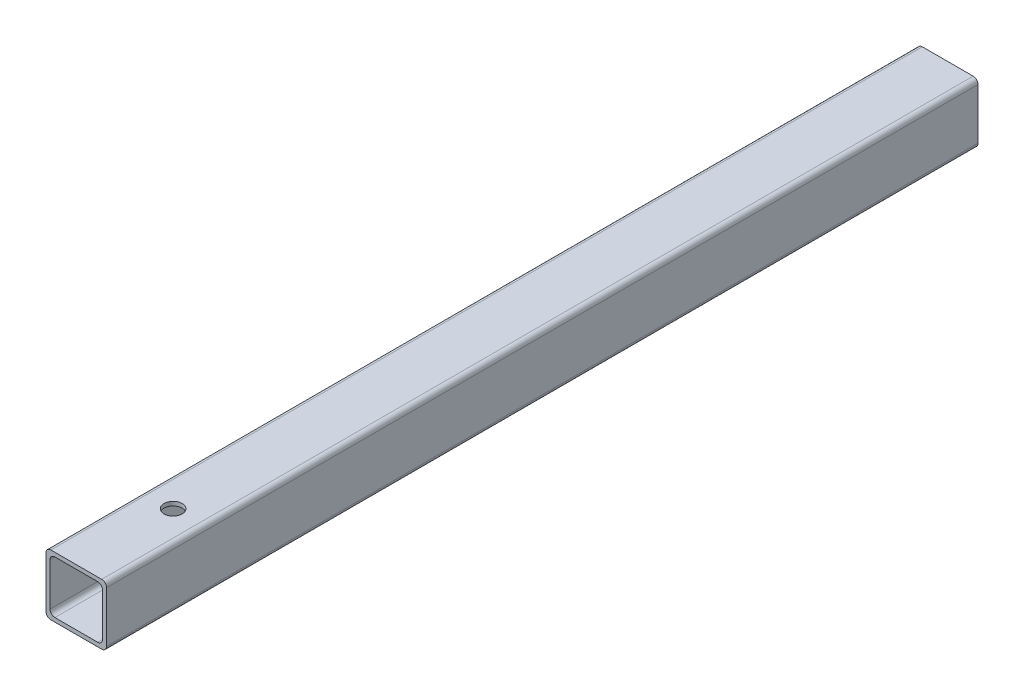
ISO-10303-21;
HEADER;
FILE_DESCRIPTION(('STEP AP214'),'2;1');
FILE_NAME('part.step','',(''),(''),'','','');
FILE_SCHEMA(('AUTOMOTIVE_DESIGN { 1 0 10303 214 1 1 1 1 }'));
ENDSEC;
DATA;
#1=APPLICATION_CONTEXT('core data for automotive mechanical design processes');
#2=APPLICATION_PROTOCOL_DEFINITION('international standard','automotive_design',2000,#1);
#3=PRODUCT_CONTEXT('',#1,'mechanical');
#4=PRODUCT('Part','Part','',(#3));
#5=PRODUCT_RELATED_PRODUCT_CATEGORY('part','',(#4));
#6=PRODUCT_DEFINITION_FORMATION('','',#4);
#7=PRODUCT_DEFINITION_CONTEXT('part definition',#1,'design');
#8=PRODUCT_DEFINITION('design','',#6,#7);
#9=PRODUCT_DEFINITION_SHAPE('','',#8);
#10=(LENGTH_UNIT() NAMED_UNIT(*) SI_UNIT(.MILLI.,.METRE.));
#11=(NAMED_UNIT(*) PLANE_ANGLE_UNIT() SI_UNIT($,.RADIAN.));
#12=(NAMED_UNIT(*) SI_UNIT($,.STERADIAN.) SOLID_ANGLE_UNIT());
#13=UNCERTAINTY_MEASURE_WITH_UNIT(LENGTH_MEASURE(1.E-05),#10,'distance_accuracy_value','');
#14=(GEOMETRIC_REPRESENTATION_CONTEXT(3) GLOBAL_UNCERTAINTY_ASSIGNED_CONTEXT((#13)) GLOBAL_UNIT_ASSIGNED_CONTEXT((#10,
#11,#12)) REPRESENTATION_CONTEXT('',''));
#15=CARTESIAN_POINT('',(0.,0.,0.));
#16=DIRECTION('',(0.,0.,1.));
#17=DIRECTION('',(1.,0.,0.));
#18=AXIS2_PLACEMENT_3D('',#15,#16,#17);
#19=CARTESIAN_POINT('',(0.,0.,457.2));
#20=DIRECTION('',(0.,0.,-1.));
#21=DIRECTION('',(-1.,0.,0.));
#22=AXIS2_PLACEMENT_3D('',#19,#20,#21);
#23=PLANE('',#22);
#24=DIRECTION('',(1.,0.,0.));
#25=VECTOR('',#24,1.);
#26=CARTESIAN_POINT('',(-15.875,-15.875,457.2));
#27=LINE('',#26,#25);
#28=CARTESIAN_POINT('',(-13.335,-15.875,457.2));
#29=VERTEX_POINT('',#28);
#30=CARTESIAN_POINT('',(13.335,-15.875,457.2));
#31=VERTEX_POINT('',#30);
#32=EDGE_CURVE('E191',#29,#31,#27,.T.);
#33=ORIENTED_EDGE('',*,*,#32,.T.);
#34=CARTESIAN_POINT('',(13.335,-13.335,457.2));
#35=DIRECTION('',(0.,0.,-1.));
#36=DIRECTION('',(-1.,0.,0.));
#37=AXIS2_PLACEMENT_3D('',#34,#35,#36);
#38=CIRCLE('',#37,2.54);
#39=CARTESIAN_POINT('',(15.875,-13.335,457.2));
#40=VERTEX_POINT('',#39);
#41=EDGE_CURVE('E212',#31,#40,#38,.F.);
#42=ORIENTED_EDGE('',*,*,#41,.T.);
#43=DIRECTION('',(0.,1.,0.));
#44=VECTOR('',#43,1.);
#45=CARTESIAN_POINT('',(15.875,-15.875,457.2));
#46=LINE('',#45,#44);
#47=CARTESIAN_POINT('',(15.875,13.335,457.2));
#48=VERTEX_POINT('',#47);
#49=EDGE_CURVE('E174',#40,#48,#46,.T.);
#50=ORIENTED_EDGE('',*,*,#49,.T.);
#51=CARTESIAN_POINT('',(13.335,13.335,457.2));
#52=DIRECTION('',(0.,0.,-1.));
#53=DIRECTION('',(-1.,0.,0.));
#54=AXIS2_PLACEMENT_3D('',#51,#52,#53);
#55=CIRCLE('',#54,2.54);
#56=CARTESIAN_POINT('',(13.335,15.875,457.2));
#57=VERTEX_POINT('',#56);
#58=EDGE_CURVE('E210',#48,#57,#55,.F.);
#59=ORIENTED_EDGE('',*,*,#58,.T.);
#60=DIRECTION('',(-1.,0.,0.));
#61=VECTOR('',#60,1.);
#62=CARTESIAN_POINT('',(-15.875,15.875,457.2));
#63=LINE('',#62,#61);
#64=CARTESIAN_POINT('',(-13.335,15.875,457.2));
#65=VERTEX_POINT('',#64);
#66=EDGE_CURVE('E290',#57,#65,#63,.T.);
#67=ORIENTED_EDGE('',*,*,#66,.T.);
#68=CARTESIAN_POINT('',(-13.335,13.335,457.2));
#69=DIRECTION('',(0.,0.,-1.));
#70=DIRECTION('',(-1.,0.,0.));
#71=AXIS2_PLACEMENT_3D('',#68,#69,#70);
#72=CIRCLE('',#71,2.54);
#73=CARTESIAN_POINT('',(-15.875,13.335,457.2));
#74=VERTEX_POINT('',#73);
#75=EDGE_CURVE('E208',#65,#74,#72,.F.);
#76=ORIENTED_EDGE('',*,*,#75,.T.);
#77=DIRECTION('',(0.,-1.,0.));
#78=VECTOR('',#77,1.);
#79=CARTESIAN_POINT('',(-15.875,-15.875,457.2));
#80=LINE('',#79,#78);
#81=CARTESIAN_POINT('',(-15.875,-13.335,457.2));
#82=VERTEX_POINT('',#81);
#83=EDGE_CURVE('E292',#74,#82,#80,.T.);
#84=ORIENTED_EDGE('',*,*,#83,.T.);
#85=CARTESIAN_POINT('',(-13.335,-13.335,457.2));
#86=DIRECTION('',(0.,0.,-1.));
#87=DIRECTION('',(-1.,0.,0.));
#88=AXIS2_PLACEMENT_3D('',#85,#86,#87);
#89=CIRCLE('',#88,2.54);
#90=EDGE_CURVE('E206',#82,#29,#89,.F.);
#91=ORIENTED_EDGE('',*,*,#90,.T.);
#92=EDGE_LOOP('',(#33,#42,#50,#59,#67,#76,#84,#91));
#93=FACE_BOUND('',#92,.T.);
#94=DIRECTION('',(0.,-1.,0.));
#95=VECTOR('',#94,1.);
#96=CARTESIAN_POINT('',(-13.7668,-13.7668,457.2));
#97=LINE('',#96,#95);
#98=CARTESIAN_POINT('',(-13.7668,11.2268,457.2));
#99=VERTEX_POINT('',#98);
#100=CARTESIAN_POINT('',(-13.7668,-11.2268,457.2));
#101=VERTEX_POINT('',#100);
#102=EDGE_CURVE('E270',#99,#101,#97,.T.);
#103=ORIENTED_EDGE('',*,*,#102,.F.);
#104=CARTESIAN_POINT('',(-11.2268,11.2268,457.2));
#105=DIRECTION('',(0.,0.,-1.));
#106=DIRECTION('',(-1.,0.,0.));
#107=AXIS2_PLACEMENT_3D('',#104,#105,#106);
#108=CIRCLE('',#107,2.54);
#109=CARTESIAN_POINT('',(-11.2268,13.7668,457.2));
#110=VERTEX_POINT('',#109);
#111=EDGE_CURVE('E252',#99,#110,#108,.T.);
#112=ORIENTED_EDGE('',*,*,#111,.T.);
#113=DIRECTION('',(-1.,0.,0.));
#114=VECTOR('',#113,1.);
#115=CARTESIAN_POINT('',(-13.7668,13.7668,457.2));
#116=LINE('',#115,#114);
#117=CARTESIAN_POINT('',(11.2268,13.7668,457.2));
#118=VERTEX_POINT('',#117);
#119=EDGE_CURVE('E182',#118,#110,#116,.T.);
#120=ORIENTED_EDGE('',*,*,#119,.F.);
#121=CARTESIAN_POINT('',(11.2268,11.2268,457.2));
#122=DIRECTION('',(0.,0.,-1.));
#123=DIRECTION('',(-1.,0.,0.));
#124=AXIS2_PLACEMENT_3D('',#121,#122,#123);
#125=CIRCLE('',#124,2.54);
#126=CARTESIAN_POINT('',(13.7668,11.2268,457.2));
#127=VERTEX_POINT('',#126);
#128=EDGE_CURVE('E248',#118,#127,#125,.T.);
#129=ORIENTED_EDGE('',*,*,#128,.T.);
#130=DIRECTION('',(0.,1.,0.));
#131=VECTOR('',#130,1.);
#132=CARTESIAN_POINT('',(13.7668,-13.7668,457.2));
#133=LINE('',#132,#131);
#134=CARTESIAN_POINT('',(13.7668,-11.2268,457.2));
#135=VERTEX_POINT('',#134);
#136=EDGE_CURVE('E188',#135,#127,#133,.T.);
#137=ORIENTED_EDGE('',*,*,#136,.F.);
#138=CARTESIAN_POINT('',(11.2268,-11.2268,457.2));
#139=DIRECTION('',(0.,0.,-1.));
#140=DIRECTION('',(-1.,0.,0.));
#141=AXIS2_PLACEMENT_3D('',#138,#139,#140);
#142=CIRCLE('',#141,2.54);
#143=CARTESIAN_POINT('',(11.2268,-13.7668,457.2));
#144=VERTEX_POINT('',#143);
#145=EDGE_CURVE('E55',#135,#144,#142,.T.);
#146=ORIENTED_EDGE('',*,*,#145,.T.);
#147=DIRECTION('',(1.,0.,0.));
#148=VECTOR('',#147,1.);
#149=CARTESIAN_POINT('',(-13.7668,-13.7668,457.2));
#150=LINE('',#149,#148);
#151=CARTESIAN_POINT('',(-11.2268,-13.7668,457.2));
#152=VERTEX_POINT('',#151);
#153=EDGE_CURVE('E272',#152,#144,#150,.T.);
#154=ORIENTED_EDGE('',*,*,#153,.F.);
#155=CARTESIAN_POINT('',(-11.2268,-11.2268,457.2));
#156=DIRECTION('',(0.,0.,-1.));
#157=DIRECTION('',(-1.,0.,0.));
#158=AXIS2_PLACEMENT_3D('',#155,#156,#157);
#159=CIRCLE('',#158,2.54);
#160=EDGE_CURVE('E11',#152,#101,#159,.T.);
#161=ORIENTED_EDGE('',*,*,#160,.T.);
#162=EDGE_LOOP('',(#103,#112,#120,#129,#137,#146,#154,#161));
#163=FACE_BOUND('',#162,.T.);
#164=ADVANCED_FACE('F39',(#93,#163),#23,.F.);
#165=CARTESIAN_POINT('',(0.,0.,0.));
#166=DIRECTION('',(0.,0.,-1.));
#167=DIRECTION('',(-1.,0.,0.));
#168=AXIS2_PLACEMENT_3D('',#165,#166,#167);
#169=PLANE('',#168);
#170=DIRECTION('',(0.,1.,0.));
#171=VECTOR('',#170,1.);
#172=CARTESIAN_POINT('',(15.875,-15.875,0.));
#173=LINE('',#172,#171);
#174=CARTESIAN_POINT('',(15.875,-13.335,0.));
#175=VERTEX_POINT('',#174);
#176=CARTESIAN_POINT('',(15.875,13.335,0.));
#177=VERTEX_POINT('',#176);
#178=EDGE_CURVE('E171',#175,#177,#173,.T.);
#179=ORIENTED_EDGE('',*,*,#178,.F.);
#180=CARTESIAN_POINT('',(13.335,-13.335,0.));
#181=DIRECTION('',(0.,0.,-1.));
#182=DIRECTION('',(-1.,0.,0.));
#183=AXIS2_PLACEMENT_3D('',#180,#181,#182);
#184=CIRCLE('',#183,2.54);
#185=CARTESIAN_POINT('',(13.335,-15.875,0.));
#186=VERTEX_POINT('',#185);
#187=EDGE_CURVE('E154',#175,#186,#184,.T.);
#188=ORIENTED_EDGE('',*,*,#187,.T.);
#189=DIRECTION('',(1.,0.,0.));
#190=VECTOR('',#189,1.);
#191=CARTESIAN_POINT('',(-15.875,-15.875,0.));
#192=LINE('',#191,#190);
#193=CARTESIAN_POINT('',(-13.335,-15.875,0.));
#194=VERTEX_POINT('',#193);
#195=EDGE_CURVE('E196',#194,#186,#192,.T.);
#196=ORIENTED_EDGE('',*,*,#195,.F.);
#197=CARTESIAN_POINT('',(-13.335,-13.335,0.));
#198=DIRECTION('',(0.,0.,-1.));
#199=DIRECTION('',(-1.,0.,0.));
#200=AXIS2_PLACEMENT_3D('',#197,#198,#199);
#201=CIRCLE('',#200,2.54);
#202=CARTESIAN_POINT('',(-15.875,-13.335,0.));
#203=VERTEX_POINT('',#202);
#204=EDGE_CURVE('E175',#194,#203,#201,.T.);
#205=ORIENTED_EDGE('',*,*,#204,.T.);
#206=DIRECTION('',(0.,-1.,0.));
#207=VECTOR('',#206,1.);
#208=CARTESIAN_POINT('',(-15.875,-15.875,0.));
#209=LINE('',#208,#207);
#210=CARTESIAN_POINT('',(-15.875,13.335,0.));
#211=VERTEX_POINT('',#210);
#212=EDGE_CURVE('E185',#211,#203,#209,.T.);
#213=ORIENTED_EDGE('',*,*,#212,.F.);
#214=CARTESIAN_POINT('',(-13.335,13.335,0.));
#215=DIRECTION('',(0.,0.,-1.));
#216=DIRECTION('',(-1.,0.,0.));
#217=AXIS2_PLACEMENT_3D('',#214,#215,#216);
#218=CIRCLE('',#217,2.54);
#219=CARTESIAN_POINT('',(-13.335,15.875,0.));
#220=VERTEX_POINT('',#219);
#221=EDGE_CURVE('E200',#211,#220,#218,.T.);
#222=ORIENTED_EDGE('',*,*,#221,.T.);
#223=DIRECTION('',(-1.,0.,0.));
#224=VECTOR('',#223,1.);
#225=CARTESIAN_POINT('',(-15.875,15.875,0.));
#226=LINE('',#225,#224);
#227=CARTESIAN_POINT('',(13.335,15.875,0.));
#228=VERTEX_POINT('',#227);
#229=EDGE_CURVE('E181',#228,#220,#226,.T.);
#230=ORIENTED_EDGE('',*,*,#229,.F.);
#231=CARTESIAN_POINT('',(13.335,13.335,0.));
#232=DIRECTION('',(0.,0.,-1.));
#233=DIRECTION('',(-1.,0.,0.));
#234=AXIS2_PLACEMENT_3D('',#231,#232,#233);
#235=CIRCLE('',#234,2.54);
#236=EDGE_CURVE('E165',#228,#177,#235,.T.);
#237=ORIENTED_EDGE('',*,*,#236,.T.);
#238=EDGE_LOOP('',(#179,#188,#196,#205,#213,#222,#230,#237));
#239=FACE_BOUND('',#238,.T.);
#240=DIRECTION('',(0.,1.,0.));
#241=VECTOR('',#240,1.);
#242=CARTESIAN_POINT('',(13.7668,-13.7668,0.));
#243=LINE('',#242,#241);
#244=CARTESIAN_POINT('',(13.7668,-11.2268,0.));
#245=VERTEX_POINT('',#244);
#246=CARTESIAN_POINT('',(13.7668,11.2268,0.));
#247=VERTEX_POINT('',#246);
#248=EDGE_CURVE('E264',#245,#247,#243,.T.);
#249=ORIENTED_EDGE('',*,*,#248,.T.);
#250=CARTESIAN_POINT('',(11.2268,11.2268,0.));
#251=DIRECTION('',(0.,0.,-1.));
#252=DIRECTION('',(-1.,0.,0.));
#253=AXIS2_PLACEMENT_3D('',#250,#251,#252);
#254=CIRCLE('',#253,2.54);
#255=CARTESIAN_POINT('',(11.2268,13.7668,0.));
#256=VERTEX_POINT('',#255);
#257=EDGE_CURVE('E246',#247,#256,#254,.F.);
#258=ORIENTED_EDGE('',*,*,#257,.T.);
#259=DIRECTION('',(-1.,0.,0.));
#260=VECTOR('',#259,1.);
#261=CARTESIAN_POINT('',(-13.7668,13.7668,0.));
#262=LINE('',#261,#260);
#263=CARTESIAN_POINT('',(-11.2268,13.7668,0.));
#264=VERTEX_POINT('',#263);
#265=EDGE_CURVE('E276',#256,#264,#262,.T.);
#266=ORIENTED_EDGE('',*,*,#265,.T.);
#267=CARTESIAN_POINT('',(-11.2268,11.2268,0.));
#268=DIRECTION('',(0.,0.,-1.));
#269=DIRECTION('',(-1.,0.,0.));
#270=AXIS2_PLACEMENT_3D('',#267,#268,#269);
#271=CIRCLE('',#270,2.54);
#272=CARTESIAN_POINT('',(-13.7668,11.2268,0.));
#273=VERTEX_POINT('',#272);
#274=EDGE_CURVE('E250',#264,#273,#271,.F.);
#275=ORIENTED_EDGE('',*,*,#274,.T.);
#276=DIRECTION('',(0.,-1.,0.));
#277=VECTOR('',#276,1.);
#278=CARTESIAN_POINT('',(-13.7668,-13.7668,0.));
#279=LINE('',#278,#277);
#280=CARTESIAN_POINT('',(-13.7668,-11.2268,0.));
#281=VERTEX_POINT('',#280);
#282=EDGE_CURVE('E259',#273,#281,#279,.T.);
#283=ORIENTED_EDGE('',*,*,#282,.T.);
#284=CARTESIAN_POINT('',(-11.2268,-11.2268,0.));
#285=DIRECTION('',(0.,0.,-1.));
#286=DIRECTION('',(-1.,0.,0.));
#287=AXIS2_PLACEMENT_3D('',#284,#285,#286);
#288=CIRCLE('',#287,2.54);
#289=CARTESIAN_POINT('',(-11.2268,-13.7668,0.));
#290=VERTEX_POINT('',#289);
#291=EDGE_CURVE('E48',#281,#290,#288,.F.);
#292=ORIENTED_EDGE('',*,*,#291,.T.);
#293=DIRECTION('',(1.,0.,0.));
#294=VECTOR('',#293,1.);
#295=CARTESIAN_POINT('',(-13.7668,-13.7668,0.));
#296=LINE('',#295,#294);
#297=CARTESIAN_POINT('',(11.2268,-13.7668,0.));
#298=VERTEX_POINT('',#297);
#299=EDGE_CURVE('E257',#290,#298,#296,.T.);
#300=ORIENTED_EDGE('',*,*,#299,.T.);
#301=CARTESIAN_POINT('',(11.2268,-11.2268,0.));
#302=DIRECTION('',(0.,0.,-1.));
#303=DIRECTION('',(-1.,0.,0.));
#304=AXIS2_PLACEMENT_3D('',#301,#302,#303);
#305=CIRCLE('',#304,2.54);
#306=EDGE_CURVE('E243',#298,#245,#305,.F.);
#307=ORIENTED_EDGE('',*,*,#306,.T.);
#308=EDGE_LOOP('',(#249,#258,#266,#275,#283,#292,#300,#307));
#309=FACE_BOUND('',#308,.T.);
#310=ADVANCED_FACE('F178',(#239,#309),#169,.T.);
#311=CARTESIAN_POINT('',(15.875,-15.875,457.2));
#312=DIRECTION('',(-1.,0.,0.));
#313=DIRECTION('',(0.,0.,1.));
#314=AXIS2_PLACEMENT_3D('',#311,#312,#313);
#315=PLANE('',#314);
#316=ORIENTED_EDGE('',*,*,#49,.F.);
#317=DIRECTION('',(0.,0.,-1.));
#318=VECTOR('',#317,1.);
#319=CARTESIAN_POINT('',(15.875,-13.335,457.2));
#320=LINE('',#319,#318);
#321=EDGE_CURVE('E158',#40,#175,#320,.T.);
#322=ORIENTED_EDGE('',*,*,#321,.T.);
#323=ORIENTED_EDGE('',*,*,#178,.T.);
#324=DIRECTION('',(0.,0.,-1.));
#325=VECTOR('',#324,1.);
#326=CARTESIAN_POINT('',(15.875,13.335,457.2));
#327=LINE('',#326,#325);
#328=EDGE_CURVE('E176',#177,#48,#327,.F.);
#329=ORIENTED_EDGE('',*,*,#328,.T.);
#330=EDGE_LOOP('',(#316,#322,#323,#329));
#331=FACE_BOUND('',#330,.T.);
#332=ADVANCED_FACE('F170',(#331),#315,.F.);
#333=CARTESIAN_POINT('',(-15.875,15.875,457.2));
#334=DIRECTION('',(0.,-1.,0.));
#335=DIRECTION('',(0.,0.,-1.));
#336=AXIS2_PLACEMENT_3D('',#333,#334,#335);
#337=PLANE('',#336);
#338=CARTESIAN_POINT('',(0.,15.875,406.4));
#339=DIRECTION('',(0.,1.,0.));
#340=DIRECTION('',(0.,0.,1.));
#341=AXIS2_PLACEMENT_3D('',#338,#339,#340);
#342=CIRCLE('',#341,4.7625);
#343=CARTESIAN_POINT('',(0.,15.875,411.1625));
#344=VERTEX_POINT('',#343);
#345=EDGE_CURVE('E392',#344,#344,#342,.T.);
#346=ORIENTED_EDGE('',*,*,#345,.F.);
#347=EDGE_LOOP('',(#346));
#348=FACE_BOUND('',#347,.T.);
#349=ORIENTED_EDGE('',*,*,#66,.F.);
#350=DIRECTION('',(0.,0.,-1.));
#351=VECTOR('',#350,1.);
#352=CARTESIAN_POINT('',(13.335,15.875,457.2));
#353=LINE('',#352,#351);
#354=EDGE_CURVE('E230',#57,#228,#353,.T.);
#355=ORIENTED_EDGE('',*,*,#354,.T.);
#356=ORIENTED_EDGE('',*,*,#229,.T.);
#357=DIRECTION('',(0.,0.,-1.));
#358=VECTOR('',#357,1.);
#359=CARTESIAN_POINT('',(-13.335,15.875,457.2));
#360=LINE('',#359,#358);
#361=EDGE_CURVE('E228',#220,#65,#360,.F.);
#362=ORIENTED_EDGE('',*,*,#361,.T.);
#363=EDGE_LOOP('',(#349,#355,#356,#362));
#364=FACE_BOUND('',#363,.T.);
#365=ADVANCED_FACE('F314',(#348,#364),#337,.F.);
#366=CARTESIAN_POINT('',(-15.875,-15.875,457.2));
#367=DIRECTION('',(1.,0.,0.));
#368=DIRECTION('',(0.,0.,-1.));
#369=AXIS2_PLACEMENT_3D('',#366,#367,#368);
#370=PLANE('',#369);
#371=ORIENTED_EDGE('',*,*,#83,.F.);
#372=DIRECTION('',(0.,0.,-1.));
#373=VECTOR('',#372,1.);
#374=CARTESIAN_POINT('',(-15.875,13.335,457.2));
#375=LINE('',#374,#373);
#376=EDGE_CURVE('E240',#74,#211,#375,.T.);
#377=ORIENTED_EDGE('',*,*,#376,.T.);
#378=ORIENTED_EDGE('',*,*,#212,.T.);
#379=DIRECTION('',(0.,0.,-1.));
#380=VECTOR('',#379,1.);
#381=CARTESIAN_POINT('',(-15.875,-13.335,457.2));
#382=LINE('',#381,#380);
#383=EDGE_CURVE('E238',#203,#82,#382,.F.);
#384=ORIENTED_EDGE('',*,*,#383,.T.);
#385=EDGE_LOOP('',(#371,#377,#378,#384));
#386=FACE_BOUND('',#385,.T.);
#387=ADVANCED_FACE('F306',(#386),#370,.F.);
#388=CARTESIAN_POINT('',(-15.875,-15.875,457.2));
#389=DIRECTION('',(0.,1.,0.));
#390=DIRECTION('',(0.,0.,1.));
#391=AXIS2_PLACEMENT_3D('',#388,#389,#390);
#392=PLANE('',#391);
#393=CARTESIAN_POINT('',(0.,-15.875,406.4));
#394=DIRECTION('',(0.,1.,0.));
#395=DIRECTION('',(0.,0.,1.));
#396=AXIS2_PLACEMENT_3D('',#393,#394,#395);
#397=CIRCLE('',#396,4.7625);
#398=CARTESIAN_POINT('',(0.,-15.875,411.1625));
#399=VERTEX_POINT('',#398);
#400=EDGE_CURVE('E389',#399,#399,#397,.T.);
#401=ORIENTED_EDGE('',*,*,#400,.T.);
#402=EDGE_LOOP('',(#401));
#403=FACE_BOUND('',#402,.T.);
#404=ORIENTED_EDGE('',*,*,#195,.T.);
#405=DIRECTION('',(0.,0.,-1.));
#406=VECTOR('',#405,1.);
#407=CARTESIAN_POINT('',(13.335,-15.875,457.2));
#408=LINE('',#407,#406);
#409=EDGE_CURVE('E159',#186,#31,#408,.F.);
#410=ORIENTED_EDGE('',*,*,#409,.T.);
#411=ORIENTED_EDGE('',*,*,#32,.F.);
#412=DIRECTION('',(0.,0.,-1.));
#413=VECTOR('',#412,1.);
#414=CARTESIAN_POINT('',(-13.335,-15.875,457.2));
#415=LINE('',#414,#413);
#416=EDGE_CURVE('E164',#29,#194,#415,.T.);
#417=ORIENTED_EDGE('',*,*,#416,.T.);
#418=EDGE_LOOP('',(#404,#410,#411,#417));
#419=FACE_BOUND('',#418,.T.);
#420=ADVANCED_FACE('F301',(#403,#419),#392,.F.);
#421=CARTESIAN_POINT('',(-13.7668,-13.7668,457.2));
#422=DIRECTION('',(1.,0.,0.));
#423=DIRECTION('',(0.,0.,-1.));
#424=AXIS2_PLACEMENT_3D('',#421,#422,#423);
#425=PLANE('',#424);
#426=ORIENTED_EDGE('',*,*,#282,.F.);
#427=DIRECTION('',(0.,0.,-1.));
#428=VECTOR('',#427,1.);
#429=CARTESIAN_POINT('',(-13.7668,11.2268,457.2));
#430=LINE('',#429,#428);
#431=EDGE_CURVE('E236',#273,#99,#430,.F.);
#432=ORIENTED_EDGE('',*,*,#431,.T.);
#433=ORIENTED_EDGE('',*,*,#102,.T.);
#434=DIRECTION('',(0.,0.,-1.));
#435=VECTOR('',#434,1.);
#436=CARTESIAN_POINT('',(-13.7668,-11.2268,0.));
#437=LINE('',#436,#435);
#438=EDGE_CURVE('E233',#101,#281,#437,.T.);
#439=ORIENTED_EDGE('',*,*,#438,.T.);
#440=EDGE_LOOP('',(#426,#432,#433,#439));
#441=FACE_BOUND('',#440,.T.);
#442=ADVANCED_FACE('F274',(#441),#425,.T.);
#443=CARTESIAN_POINT('',(-13.7668,-13.7668,457.2));
#444=DIRECTION('',(0.,1.,0.));
#445=DIRECTION('',(0.,0.,1.));
#446=AXIS2_PLACEMENT_3D('',#443,#444,#445);
#447=PLANE('',#446);
#448=CARTESIAN_POINT('',(0.,-13.7668,406.4));
#449=DIRECTION('',(0.,1.,0.));
#450=DIRECTION('',(0.,0.,1.));
#451=AXIS2_PLACEMENT_3D('',#448,#449,#450);
#452=CIRCLE('',#451,4.7625);
#453=CARTESIAN_POINT('',(0.,-13.7668,411.1625));
#454=VERTEX_POINT('',#453);
#455=EDGE_CURVE('E282',#454,#454,#452,.T.);
#456=ORIENTED_EDGE('',*,*,#455,.F.);
#457=EDGE_LOOP('',(#456));
#458=FACE_BOUND('',#457,.T.);
#459=ORIENTED_EDGE('',*,*,#153,.T.);
#460=DIRECTION('',(0.,0.,-1.));
#461=VECTOR('',#460,1.);
#462=CARTESIAN_POINT('',(11.2268,-13.7668,0.));
#463=LINE('',#462,#461);
#464=EDGE_CURVE('E215',#144,#298,#463,.T.);
#465=ORIENTED_EDGE('',*,*,#464,.T.);
#466=ORIENTED_EDGE('',*,*,#299,.F.);
#467=DIRECTION('',(0.,0.,-1.));
#468=VECTOR('',#467,1.);
#469=CARTESIAN_POINT('',(-11.2268,-13.7668,457.2));
#470=LINE('',#469,#468);
#471=EDGE_CURVE('E62',#290,#152,#470,.F.);
#472=ORIENTED_EDGE('',*,*,#471,.T.);
#473=EDGE_LOOP('',(#459,#465,#466,#472));
#474=FACE_BOUND('',#473,.T.);
#475=ADVANCED_FACE('F262',(#458,#474),#447,.T.);
#476=CARTESIAN_POINT('',(13.7668,-13.7668,457.2));
#477=DIRECTION('',(-1.,0.,0.));
#478=DIRECTION('',(0.,0.,1.));
#479=AXIS2_PLACEMENT_3D('',#476,#477,#478);
#480=PLANE('',#479);
#481=ORIENTED_EDGE('',*,*,#248,.F.);
#482=DIRECTION('',(0.,0.,-1.));
#483=VECTOR('',#482,1.);
#484=CARTESIAN_POINT('',(13.7668,-11.2268,457.2));
#485=LINE('',#484,#483);
#486=EDGE_CURVE('E221',#245,#135,#485,.F.);
#487=ORIENTED_EDGE('',*,*,#486,.T.);
#488=ORIENTED_EDGE('',*,*,#136,.T.);
#489=DIRECTION('',(0.,0.,-1.));
#490=VECTOR('',#489,1.);
#491=CARTESIAN_POINT('',(13.7668,11.2268,0.));
#492=LINE('',#491,#490);
#493=EDGE_CURVE('E218',#127,#247,#492,.T.);
#494=ORIENTED_EDGE('',*,*,#493,.T.);
#495=EDGE_LOOP('',(#481,#487,#488,#494));
#496=FACE_BOUND('',#495,.T.);
#497=ADVANCED_FACE('F361',(#496),#480,.T.);
#498=CARTESIAN_POINT('',(-13.7668,13.7668,457.2));
#499=DIRECTION('',(0.,-1.,0.));
#500=DIRECTION('',(1.,0.,0.));
#501=AXIS2_PLACEMENT_3D('',#498,#499,#500);
#502=PLANE('',#501);
#503=CARTESIAN_POINT('',(0.,13.7668,406.4));
#504=DIRECTION('',(0.,-1.,0.));
#505=DIRECTION('',(1.,0.,0.));
#506=AXIS2_PLACEMENT_3D('',#503,#504,#505);
#507=CIRCLE('',#506,4.7625);
#508=CARTESIAN_POINT('',(4.7625,13.7668,406.4));
#509=VERTEX_POINT('',#508);
#510=EDGE_CURVE('E43',#509,#509,#507,.T.);
#511=ORIENTED_EDGE('',*,*,#510,.F.);
#512=EDGE_LOOP('',(#511));
#513=FACE_BOUND('',#512,.T.);
#514=ORIENTED_EDGE('',*,*,#265,.F.);
#515=DIRECTION('',(0.,0.,-1.));
#516=VECTOR('',#515,1.);
#517=CARTESIAN_POINT('',(11.2268,13.7668,457.2));
#518=LINE('',#517,#516);
#519=EDGE_CURVE('E226',#256,#118,#518,.F.);
#520=ORIENTED_EDGE('',*,*,#519,.T.);
#521=ORIENTED_EDGE('',*,*,#119,.T.);
#522=DIRECTION('',(0.,0.,-1.));
#523=VECTOR('',#522,1.);
#524=CARTESIAN_POINT('',(-11.2268,13.7668,0.));
#525=LINE('',#524,#523);
#526=EDGE_CURVE('E223',#110,#264,#525,.T.);
#527=ORIENTED_EDGE('',*,*,#526,.T.);
#528=EDGE_LOOP('',(#514,#520,#521,#527));
#529=FACE_BOUND('',#528,.T.);
#530=ADVANCED_FACE('F353',(#513,#529),#502,.T.);
#531=CARTESIAN_POINT('',(13.335,-13.335,457.2));
#532=DIRECTION('',(0.,0.,-1.));
#533=DIRECTION('',(-1.,0.,0.));
#534=AXIS2_PLACEMENT_3D('',#531,#532,#533);
#535=CYLINDRICAL_SURFACE('',#534,2.54);
#536=ORIENTED_EDGE('',*,*,#41,.F.);
#537=ORIENTED_EDGE('',*,*,#409,.F.);
#538=ORIENTED_EDGE('',*,*,#187,.F.);
#539=ORIENTED_EDGE('',*,*,#321,.F.);
#540=EDGE_LOOP('',(#536,#537,#538,#539));
#541=FACE_BOUND('',#540,.T.);
#542=ADVANCED_FACE('F157',(#541),#535,.T.);
#543=CARTESIAN_POINT('',(11.2268,-11.2268,457.2));
#544=DIRECTION('',(0.,0.,1.));
#545=DIRECTION('',(1.,0.,0.));
#546=AXIS2_PLACEMENT_3D('',#543,#544,#545);
#547=CYLINDRICAL_SURFACE('',#546,2.54);
#548=ORIENTED_EDGE('',*,*,#145,.F.);
#549=ORIENTED_EDGE('',*,*,#486,.F.);
#550=ORIENTED_EDGE('',*,*,#306,.F.);
#551=ORIENTED_EDGE('',*,*,#464,.F.);
#552=EDGE_LOOP('',(#548,#549,#550,#551));
#553=FACE_BOUND('',#552,.T.);
#554=ADVANCED_FACE('F329',(#553),#547,.F.);
#555=CARTESIAN_POINT('',(11.2268,11.2268,457.2));
#556=DIRECTION('',(0.,0.,1.));
#557=DIRECTION('',(1.,0.,0.));
#558=AXIS2_PLACEMENT_3D('',#555,#556,#557);
#559=CYLINDRICAL_SURFACE('',#558,2.54);
#560=ORIENTED_EDGE('',*,*,#128,.F.);
#561=ORIENTED_EDGE('',*,*,#519,.F.);
#562=ORIENTED_EDGE('',*,*,#257,.F.);
#563=ORIENTED_EDGE('',*,*,#493,.F.);
#564=EDGE_LOOP('',(#560,#561,#562,#563));
#565=FACE_BOUND('',#564,.T.);
#566=ADVANCED_FACE('F321',(#565),#559,.F.);
#567=CARTESIAN_POINT('',(13.335,13.335,457.2));
#568=DIRECTION('',(0.,0.,-1.));
#569=DIRECTION('',(-1.,0.,0.));
#570=AXIS2_PLACEMENT_3D('',#567,#568,#569);
#571=CYLINDRICAL_SURFACE('',#570,2.54);
#572=ORIENTED_EDGE('',*,*,#58,.F.);
#573=ORIENTED_EDGE('',*,*,#328,.F.);
#574=ORIENTED_EDGE('',*,*,#236,.F.);
#575=ORIENTED_EDGE('',*,*,#354,.F.);
#576=EDGE_LOOP('',(#572,#573,#574,#575));
#577=FACE_BOUND('',#576,.T.);
#578=ADVANCED_FACE('F318',(#577),#571,.T.);
#579=CARTESIAN_POINT('',(-11.2268,11.2268,457.2));
#580=DIRECTION('',(0.,0.,1.));
#581=DIRECTION('',(1.,0.,0.));
#582=AXIS2_PLACEMENT_3D('',#579,#580,#581);
#583=CYLINDRICAL_SURFACE('',#582,2.54);
#584=ORIENTED_EDGE('',*,*,#111,.F.);
#585=ORIENTED_EDGE('',*,*,#431,.F.);
#586=ORIENTED_EDGE('',*,*,#274,.F.);
#587=ORIENTED_EDGE('',*,*,#526,.F.);
#588=EDGE_LOOP('',(#584,#585,#586,#587));
#589=FACE_BOUND('',#588,.T.);
#590=ADVANCED_FACE('F320',(#589),#583,.F.);
#591=CARTESIAN_POINT('',(-13.335,13.335,457.2));
#592=DIRECTION('',(0.,0.,-1.));
#593=DIRECTION('',(-1.,0.,0.));
#594=AXIS2_PLACEMENT_3D('',#591,#592,#593);
#595=CYLINDRICAL_SURFACE('',#594,2.54);
#596=ORIENTED_EDGE('',*,*,#75,.F.);
#597=ORIENTED_EDGE('',*,*,#361,.F.);
#598=ORIENTED_EDGE('',*,*,#221,.F.);
#599=ORIENTED_EDGE('',*,*,#376,.F.);
#600=EDGE_LOOP('',(#596,#597,#598,#599));
#601=FACE_BOUND('',#600,.T.);
#602=ADVANCED_FACE('F310',(#601),#595,.T.);
#603=CARTESIAN_POINT('',(-11.2268,-11.2268,457.2));
#604=DIRECTION('',(0.,0.,1.));
#605=DIRECTION('',(1.,0.,0.));
#606=AXIS2_PLACEMENT_3D('',#603,#604,#605);
#607=CYLINDRICAL_SURFACE('',#606,2.54);
#608=ORIENTED_EDGE('',*,*,#160,.F.);
#609=ORIENTED_EDGE('',*,*,#471,.F.);
#610=ORIENTED_EDGE('',*,*,#291,.F.);
#611=ORIENTED_EDGE('',*,*,#438,.F.);
#612=EDGE_LOOP('',(#608,#609,#610,#611));
#613=FACE_BOUND('',#612,.T.);
#614=ADVANCED_FACE('F267',(#613),#607,.F.);
#615=CARTESIAN_POINT('',(-13.335,-13.335,457.2));
#616=DIRECTION('',(0.,0.,-1.));
#617=DIRECTION('',(-1.,0.,0.));
#618=AXIS2_PLACEMENT_3D('',#615,#616,#617);
#619=CYLINDRICAL_SURFACE('',#618,2.54);
#620=ORIENTED_EDGE('',*,*,#90,.F.);
#621=ORIENTED_EDGE('',*,*,#383,.F.);
#622=ORIENTED_EDGE('',*,*,#204,.F.);
#623=ORIENTED_EDGE('',*,*,#416,.F.);
#624=EDGE_LOOP('',(#620,#621,#622,#623));
#625=FACE_BOUND('',#624,.T.);
#626=ADVANCED_FACE('F41',(#625),#619,.T.);
#627=CARTESIAN_POINT('',(0.,-15.875,406.4));
#628=DIRECTION('',(0.,1.,0.));
#629=DIRECTION('',(0.,0.,1.));
#630=AXIS2_PLACEMENT_3D('',#627,#628,#629);
#631=CYLINDRICAL_SURFACE('',#630,4.7625);
#632=ORIENTED_EDGE('',*,*,#510,.T.);
#633=EDGE_LOOP('',(#632));
#634=FACE_BOUND('',#633,.T.);
#635=ORIENTED_EDGE('',*,*,#345,.T.);
#636=EDGE_LOOP('',(#635));
#637=FACE_BOUND('',#636,.T.);
#638=ADVANCED_FACE('F380',(#634,#637),#631,.F.);
#639=ORIENTED_EDGE('',*,*,#455,.T.);
#640=EDGE_LOOP('',(#639));
#641=FACE_BOUND('',#640,.T.);
#642=ORIENTED_EDGE('',*,*,#400,.F.);
#643=EDGE_LOOP('',(#642));
#644=FACE_BOUND('',#643,.T.);
#645=ADVANCED_FACE('F399',(#641,#644),#631,.F.);
#646=CLOSED_SHELL('',(#164,#310,#332,#365,#387,#420,#442,#475,#497,#530,#542,#554,#566,#578,
#590,#602,#614,#626,#638,#645));
#647=MANIFOLD_SOLID_BREP('B2',#646);
#648=ADVANCED_BREP_SHAPE_REPRESENTATION('',(#18,#647),#14);
#649=SHAPE_DEFINITION_REPRESENTATION(#9,#648);
ENDSEC;
END-ISO-10303-21;
